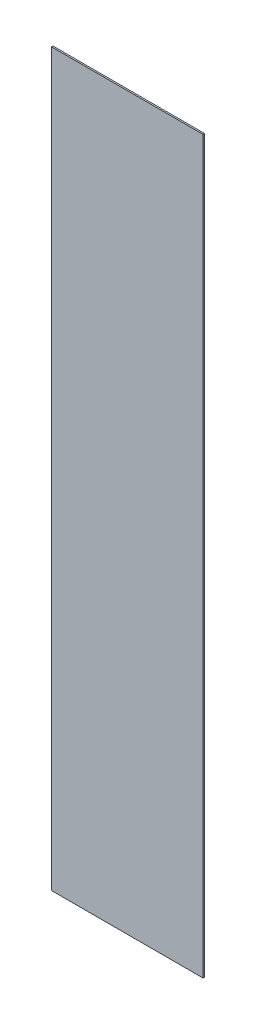
ISO-10303-21;
HEADER;
FILE_DESCRIPTION(('STEP AP214'),'2;1');
FILE_NAME('part.step','',(''),(''),'','','');
FILE_SCHEMA(('AUTOMOTIVE_DESIGN { 1 0 10303 214 1 1 1 1 }'));
ENDSEC;
DATA;
#1=APPLICATION_CONTEXT('core data for automotive mechanical design processes');
#2=APPLICATION_PROTOCOL_DEFINITION('international standard','automotive_design',2000,#1);
#3=PRODUCT_CONTEXT('',#1,'mechanical');
#4=PRODUCT('Part','Part','',(#3));
#5=PRODUCT_RELATED_PRODUCT_CATEGORY('part','',(#4));
#6=PRODUCT_DEFINITION_FORMATION('','',#4);
#7=PRODUCT_DEFINITION_CONTEXT('part definition',#1,'design');
#8=PRODUCT_DEFINITION('design','',#6,#7);
#9=PRODUCT_DEFINITION_SHAPE('','',#8);
#10=(LENGTH_UNIT() NAMED_UNIT(*) SI_UNIT(.MILLI.,.METRE.));
#11=(NAMED_UNIT(*) PLANE_ANGLE_UNIT() SI_UNIT($,.RADIAN.));
#12=(NAMED_UNIT(*) SI_UNIT($,.STERADIAN.) SOLID_ANGLE_UNIT());
#13=UNCERTAINTY_MEASURE_WITH_UNIT(LENGTH_MEASURE(1.E-05),#10,'distance_accuracy_value','');
#14=(GEOMETRIC_REPRESENTATION_CONTEXT(3) GLOBAL_UNCERTAINTY_ASSIGNED_CONTEXT((#13)) GLOBAL_UNIT_ASSIGNED_CONTEXT((#10,
#11,#12)) REPRESENTATION_CONTEXT('',''));
#15=CARTESIAN_POINT('',(0.,0.,0.));
#16=DIRECTION('',(0.,0.,1.));
#17=DIRECTION('',(1.,0.,0.));
#18=AXIS2_PLACEMENT_3D('',#15,#16,#17);
#19=CARTESIAN_POINT('',(-500.,-2412.525,10.));
#20=DIRECTION('',(1.,0.,0.));
#21=DIRECTION('',(0.,0.,-1.));
#22=AXIS2_PLACEMENT_3D('',#19,#20,#21);
#23=PLANE('',#22);
#24=DIRECTION('',(0.,-1.,0.));
#25=VECTOR('',#24,1.);
#26=CARTESIAN_POINT('',(-500.,-2412.525,0.));
#27=LINE('',#26,#25);
#28=CARTESIAN_POINT('',(-500.,2412.525,0.));
#29=VERTEX_POINT('',#28);
#30=CARTESIAN_POINT('',(-500.,-2412.525,0.));
#31=VERTEX_POINT('',#30);
#32=EDGE_CURVE('E96',#29,#31,#27,.T.);
#33=ORIENTED_EDGE('',*,*,#32,.T.);
#34=DIRECTION('',(0.,0.,-1.));
#35=VECTOR('',#34,1.);
#36=CARTESIAN_POINT('',(-500.,-2412.525,10.));
#37=LINE('',#36,#35);
#38=CARTESIAN_POINT('',(-500.,-2412.525,10.));
#39=VERTEX_POINT('',#38);
#40=EDGE_CURVE('E11',#39,#31,#37,.T.);
#41=ORIENTED_EDGE('',*,*,#40,.F.);
#42=DIRECTION('',(0.,-1.,0.));
#43=VECTOR('',#42,1.);
#44=CARTESIAN_POINT('',(-500.,-2412.525,10.));
#45=LINE('',#44,#43);
#46=CARTESIAN_POINT('',(-500.,2412.525,10.));
#47=VERTEX_POINT('',#46);
#48=EDGE_CURVE('E84',#47,#39,#45,.T.);
#49=ORIENTED_EDGE('',*,*,#48,.F.);
#50=DIRECTION('',(0.,0.,-1.));
#51=VECTOR('',#50,1.);
#52=CARTESIAN_POINT('',(-500.,2412.525,10.));
#53=LINE('',#52,#51);
#54=EDGE_CURVE('E92',#47,#29,#53,.T.);
#55=ORIENTED_EDGE('',*,*,#54,.T.);
#56=EDGE_LOOP('',(#33,#41,#49,#55));
#57=FACE_BOUND('',#56,.T.);
#58=ADVANCED_FACE('F33',(#57),#23,.F.);
#59=CARTESIAN_POINT('',(500.,-2412.525,10.));
#60=DIRECTION('',(0.,1.,0.));
#61=DIRECTION('',(0.,0.,1.));
#62=AXIS2_PLACEMENT_3D('',#59,#60,#61);
#63=PLANE('',#62);
#64=DIRECTION('',(1.,0.,0.));
#65=VECTOR('',#64,1.);
#66=CARTESIAN_POINT('',(500.,-2412.525,0.));
#67=LINE('',#66,#65);
#68=CARTESIAN_POINT('',(500.,-2412.525,0.));
#69=VERTEX_POINT('',#68);
#70=EDGE_CURVE('E88',#31,#69,#67,.T.);
#71=ORIENTED_EDGE('',*,*,#70,.T.);
#72=DIRECTION('',(0.,0.,-1.));
#73=VECTOR('',#72,1.);
#74=CARTESIAN_POINT('',(500.,-2412.525,10.));
#75=LINE('',#74,#73);
#76=CARTESIAN_POINT('',(500.,-2412.525,10.));
#77=VERTEX_POINT('',#76);
#78=EDGE_CURVE('E41',#77,#69,#75,.T.);
#79=ORIENTED_EDGE('',*,*,#78,.F.);
#80=DIRECTION('',(1.,0.,0.));
#81=VECTOR('',#80,1.);
#82=CARTESIAN_POINT('',(500.,-2412.525,10.));
#83=LINE('',#82,#81);
#84=EDGE_CURVE('E79',#39,#77,#83,.T.);
#85=ORIENTED_EDGE('',*,*,#84,.F.);
#86=ORIENTED_EDGE('',*,*,#40,.T.);
#87=EDGE_LOOP('',(#71,#79,#85,#86));
#88=FACE_BOUND('',#87,.T.);
#89=ADVANCED_FACE('F87',(#88),#63,.F.);
#90=CARTESIAN_POINT('',(500.,-2412.525,10.));
#91=DIRECTION('',(-1.,0.,0.));
#92=DIRECTION('',(0.,0.,1.));
#93=AXIS2_PLACEMENT_3D('',#90,#91,#92);
#94=PLANE('',#93);
#95=DIRECTION('',(0.,1.,0.));
#96=VECTOR('',#95,1.);
#97=CARTESIAN_POINT('',(500.,-2412.525,0.));
#98=LINE('',#97,#96);
#99=CARTESIAN_POINT('',(500.,2412.525,0.));
#100=VERTEX_POINT('',#99);
#101=EDGE_CURVE('E66',#69,#100,#98,.T.);
#102=ORIENTED_EDGE('',*,*,#101,.T.);
#103=DIRECTION('',(0.,0.,-1.));
#104=VECTOR('',#103,1.);
#105=CARTESIAN_POINT('',(500.,2412.525,10.));
#106=LINE('',#105,#104);
#107=CARTESIAN_POINT('',(500.,2412.525,10.));
#108=VERTEX_POINT('',#107);
#109=EDGE_CURVE('E89',#108,#100,#106,.T.);
#110=ORIENTED_EDGE('',*,*,#109,.F.);
#111=DIRECTION('',(0.,1.,0.));
#112=VECTOR('',#111,1.);
#113=CARTESIAN_POINT('',(500.,-2412.525,10.));
#114=LINE('',#113,#112);
#115=EDGE_CURVE('E82',#77,#108,#114,.T.);
#116=ORIENTED_EDGE('',*,*,#115,.F.);
#117=ORIENTED_EDGE('',*,*,#78,.T.);
#118=EDGE_LOOP('',(#102,#110,#116,#117));
#119=FACE_BOUND('',#118,.T.);
#120=ADVANCED_FACE('F90',(#119),#94,.F.);
#121=CARTESIAN_POINT('',(500.,2412.525,10.));
#122=DIRECTION('',(0.,-1.,0.));
#123=DIRECTION('',(0.,0.,-1.));
#124=AXIS2_PLACEMENT_3D('',#121,#122,#123);
#125=PLANE('',#124);
#126=DIRECTION('',(-1.,0.,0.));
#127=VECTOR('',#126,1.);
#128=CARTESIAN_POINT('',(500.,2412.525,0.));
#129=LINE('',#128,#127);
#130=EDGE_CURVE('E72',#100,#29,#129,.T.);
#131=ORIENTED_EDGE('',*,*,#130,.T.);
#132=ORIENTED_EDGE('',*,*,#54,.F.);
#133=DIRECTION('',(-1.,0.,0.));
#134=VECTOR('',#133,1.);
#135=CARTESIAN_POINT('',(500.,2412.525,10.));
#136=LINE('',#135,#134);
#137=EDGE_CURVE('E49',#108,#47,#136,.T.);
#138=ORIENTED_EDGE('',*,*,#137,.F.);
#139=ORIENTED_EDGE('',*,*,#109,.T.);
#140=EDGE_LOOP('',(#131,#132,#138,#139));
#141=FACE_BOUND('',#140,.T.);
#142=ADVANCED_FACE('F103',(#141),#125,.F.);
#143=CARTESIAN_POINT('',(0.,0.,10.));
#144=DIRECTION('',(0.,0.,1.));
#145=DIRECTION('',(1.,0.,0.));
#146=AXIS2_PLACEMENT_3D('',#143,#144,#145);
#147=PLANE('',#146);
#148=ORIENTED_EDGE('',*,*,#48,.T.);
#149=ORIENTED_EDGE('',*,*,#84,.T.);
#150=ORIENTED_EDGE('',*,*,#115,.T.);
#151=ORIENTED_EDGE('',*,*,#137,.T.);
#152=EDGE_LOOP('',(#148,#149,#150,#151));
#153=FACE_BOUND('',#152,.T.);
#154=ADVANCED_FACE('F80',(#153),#147,.T.);
#155=CARTESIAN_POINT('',(0.,0.,0.));
#156=DIRECTION('',(0.,0.,1.));
#157=DIRECTION('',(1.,0.,0.));
#158=AXIS2_PLACEMENT_3D('',#155,#156,#157);
#159=PLANE('',#158);
#160=ORIENTED_EDGE('',*,*,#32,.F.);
#161=ORIENTED_EDGE('',*,*,#130,.F.);
#162=ORIENTED_EDGE('',*,*,#101,.F.);
#163=ORIENTED_EDGE('',*,*,#70,.F.);
#164=EDGE_LOOP('',(#160,#161,#162,#163));
#165=FACE_BOUND('',#164,.T.);
#166=ADVANCED_FACE('F106',(#165),#159,.F.);
#167=CLOSED_SHELL('',(#58,#89,#120,#142,#154,#166));
#168=MANIFOLD_SOLID_BREP('B2',#167);
#169=ADVANCED_BREP_SHAPE_REPRESENTATION('',(#18,#168),#14);
#170=SHAPE_DEFINITION_REPRESENTATION(#9,#169);
ENDSEC;
END-ISO-10303-21;
